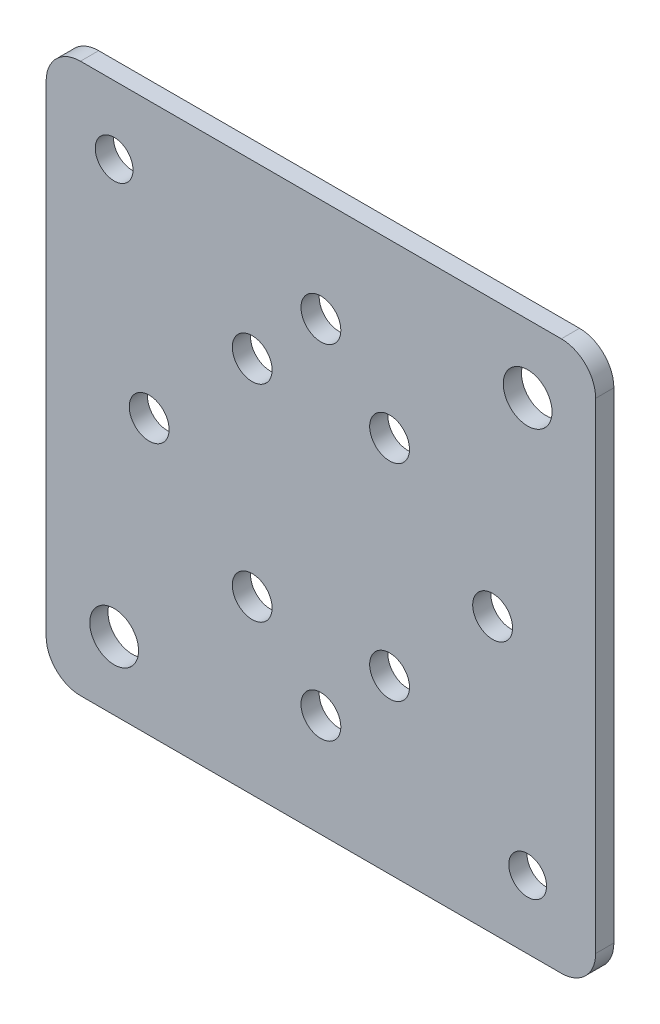
ISO-10303-21;
HEADER;
FILE_DESCRIPTION(('STEP AP214'),'2;1');
FILE_NAME('part.step','',(''),(''),'','','');
FILE_SCHEMA(('AUTOMOTIVE_DESIGN { 1 0 10303 214 1 1 1 1 }'));
ENDSEC;
DATA;
#1=APPLICATION_CONTEXT('core data for automotive mechanical design processes');
#2=APPLICATION_PROTOCOL_DEFINITION('international standard','automotive_design',2000,#1);
#3=PRODUCT_CONTEXT('',#1,'mechanical');
#4=PRODUCT('Part','Part','',(#3));
#5=PRODUCT_RELATED_PRODUCT_CATEGORY('part','',(#4));
#6=PRODUCT_DEFINITION_FORMATION('','',#4);
#7=PRODUCT_DEFINITION_CONTEXT('part definition',#1,'design');
#8=PRODUCT_DEFINITION('design','',#6,#7);
#9=PRODUCT_DEFINITION_SHAPE('','',#8);
#10=(LENGTH_UNIT() NAMED_UNIT(*) SI_UNIT(.MILLI.,.METRE.));
#11=(NAMED_UNIT(*) PLANE_ANGLE_UNIT() SI_UNIT($,.RADIAN.));
#12=(NAMED_UNIT(*) SI_UNIT($,.STERADIAN.) SOLID_ANGLE_UNIT());
#13=UNCERTAINTY_MEASURE_WITH_UNIT(LENGTH_MEASURE(1.E-05),#10,'distance_accuracy_value','');
#14=(GEOMETRIC_REPRESENTATION_CONTEXT(3) GLOBAL_UNCERTAINTY_ASSIGNED_CONTEXT((#13)) GLOBAL_UNIT_ASSIGNED_CONTEXT((#10,
#11,#12)) REPRESENTATION_CONTEXT('',''));
#15=CARTESIAN_POINT('',(0.,0.,0.));
#16=DIRECTION('',(0.,0.,1.));
#17=DIRECTION('',(1.,0.,0.));
#18=AXIS2_PLACEMENT_3D('',#15,#16,#17);
#19=CARTESIAN_POINT('',(40.,40.,-2.65));
#20=DIRECTION('',(1.,0.,0.));
#21=DIRECTION('',(0.,1.,0.));
#22=AXIS2_PLACEMENT_3D('',#19,#20,#21);
#23=PLANE('',#22);
#24=DIRECTION('',(0.,1.,0.));
#25=VECTOR('',#24,1.);
#26=CARTESIAN_POINT('',(40.,40.,-2.65));
#27=LINE('',#26,#25);
#28=CARTESIAN_POINT('',(40.,-35.,-2.65));
#29=VERTEX_POINT('',#28);
#30=CARTESIAN_POINT('',(40.,35.,-2.65));
#31=VERTEX_POINT('',#30);
#32=EDGE_CURVE('E146',#29,#31,#27,.T.);
#33=ORIENTED_EDGE('',*,*,#32,.T.);
#34=DIRECTION('',(0.,0.,1.));
#35=VECTOR('',#34,1.);
#36=CARTESIAN_POINT('',(40.,35.,-2.65));
#37=LINE('',#36,#35);
#38=CARTESIAN_POINT('',(40.,35.,0.));
#39=VERTEX_POINT('',#38);
#40=EDGE_CURVE('E92',#31,#39,#37,.T.);
#41=ORIENTED_EDGE('',*,*,#40,.T.);
#42=DIRECTION('',(0.,1.,0.));
#43=VECTOR('',#42,1.);
#44=CARTESIAN_POINT('',(40.,40.,0.));
#45=LINE('',#44,#43);
#46=CARTESIAN_POINT('',(40.,-35.,0.));
#47=VERTEX_POINT('',#46);
#48=EDGE_CURVE('E84',#47,#39,#45,.T.);
#49=ORIENTED_EDGE('',*,*,#48,.F.);
#50=DIRECTION('',(0.,0.,1.));
#51=VECTOR('',#50,1.);
#52=CARTESIAN_POINT('',(40.,-35.,-2.65));
#53=LINE('',#52,#51);
#54=EDGE_CURVE('E97',#47,#29,#53,.F.);
#55=ORIENTED_EDGE('',*,*,#54,.T.);
#56=EDGE_LOOP('',(#33,#41,#49,#55));
#57=FACE_BOUND('',#56,.T.);
#58=ADVANCED_FACE('F16',(#57),#23,.T.);
#59=CARTESIAN_POINT('',(-40.,-40.,-2.65));
#60=DIRECTION('',(0.,-1.,0.));
#61=DIRECTION('',(0.,0.,-1.));
#62=AXIS2_PLACEMENT_3D('',#59,#60,#61);
#63=PLANE('',#62);
#64=DIRECTION('',(1.,0.,0.));
#65=VECTOR('',#64,1.);
#66=CARTESIAN_POINT('',(-40.,-40.,0.));
#67=LINE('',#66,#65);
#68=CARTESIAN_POINT('',(-35.,-40.,0.));
#69=VERTEX_POINT('',#68);
#70=CARTESIAN_POINT('',(35.,-40.,0.));
#71=VERTEX_POINT('',#70);
#72=EDGE_CURVE('E86',#69,#71,#67,.T.);
#73=ORIENTED_EDGE('',*,*,#72,.F.);
#74=DIRECTION('',(0.,0.,1.));
#75=VECTOR('',#74,1.);
#76=CARTESIAN_POINT('',(-35.,-40.,-2.65));
#77=LINE('',#76,#75);
#78=CARTESIAN_POINT('',(-35.,-40.,-2.65));
#79=VERTEX_POINT('',#78);
#80=EDGE_CURVE('E11',#69,#79,#77,.F.);
#81=ORIENTED_EDGE('',*,*,#80,.T.);
#82=DIRECTION('',(1.,0.,0.));
#83=VECTOR('',#82,1.);
#84=CARTESIAN_POINT('',(-40.,-40.,-2.65));
#85=LINE('',#84,#83);
#86=CARTESIAN_POINT('',(35.,-40.,-2.65));
#87=VERTEX_POINT('',#86);
#88=EDGE_CURVE('E106',#79,#87,#85,.T.);
#89=ORIENTED_EDGE('',*,*,#88,.T.);
#90=DIRECTION('',(0.,0.,1.));
#91=VECTOR('',#90,1.);
#92=CARTESIAN_POINT('',(35.,-40.,-2.65));
#93=LINE('',#92,#91);
#94=EDGE_CURVE('E24',#87,#71,#93,.T.);
#95=ORIENTED_EDGE('',*,*,#94,.T.);
#96=EDGE_LOOP('',(#73,#81,#89,#95));
#97=FACE_BOUND('',#96,.T.);
#98=ADVANCED_FACE('F135',(#97),#63,.T.);
#99=CARTESIAN_POINT('',(-40.,40.,-2.65));
#100=DIRECTION('',(-1.,0.,0.));
#101=DIRECTION('',(0.,-1.,0.));
#102=AXIS2_PLACEMENT_3D('',#99,#100,#101);
#103=PLANE('',#102);
#104=DIRECTION('',(0.,-1.,0.));
#105=VECTOR('',#104,1.);
#106=CARTESIAN_POINT('',(-40.,40.,0.));
#107=LINE('',#106,#105);
#108=CARTESIAN_POINT('',(-40.,35.,0.));
#109=VERTEX_POINT('',#108);
#110=CARTESIAN_POINT('',(-40.,-35.,0.));
#111=VERTEX_POINT('',#110);
#112=EDGE_CURVE('E144',#109,#111,#107,.T.);
#113=ORIENTED_EDGE('',*,*,#112,.F.);
#114=DIRECTION('',(0.,0.,1.));
#115=VECTOR('',#114,1.);
#116=CARTESIAN_POINT('',(-40.,35.,-2.65));
#117=LINE('',#116,#115);
#118=CARTESIAN_POINT('',(-40.,35.,-2.65));
#119=VERTEX_POINT('',#118);
#120=EDGE_CURVE('E38',#109,#119,#117,.F.);
#121=ORIENTED_EDGE('',*,*,#120,.T.);
#122=DIRECTION('',(0.,-1.,0.));
#123=VECTOR('',#122,1.);
#124=CARTESIAN_POINT('',(-40.,40.,-2.65));
#125=LINE('',#124,#123);
#126=CARTESIAN_POINT('',(-40.,-35.,-2.65));
#127=VERTEX_POINT('',#126);
#128=EDGE_CURVE('E110',#119,#127,#125,.T.);
#129=ORIENTED_EDGE('',*,*,#128,.T.);
#130=DIRECTION('',(0.,0.,1.));
#131=VECTOR('',#130,1.);
#132=CARTESIAN_POINT('',(-40.,-35.,-2.65));
#133=LINE('',#132,#131);
#134=EDGE_CURVE('E131',#127,#111,#133,.T.);
#135=ORIENTED_EDGE('',*,*,#134,.T.);
#136=EDGE_LOOP('',(#113,#121,#129,#135));
#137=FACE_BOUND('',#136,.T.);
#138=ADVANCED_FACE('F143',(#137),#103,.T.);
#139=CARTESIAN_POINT('',(-40.,40.,-2.65));
#140=DIRECTION('',(0.,1.,0.));
#141=DIRECTION('',(0.,0.,1.));
#142=AXIS2_PLACEMENT_3D('',#139,#140,#141);
#143=PLANE('',#142);
#144=DIRECTION('',(-1.,0.,0.));
#145=VECTOR('',#144,1.);
#146=CARTESIAN_POINT('',(-40.,40.,0.));
#147=LINE('',#146,#145);
#148=CARTESIAN_POINT('',(35.,40.,0.));
#149=VERTEX_POINT('',#148);
#150=CARTESIAN_POINT('',(-35.,40.,0.));
#151=VERTEX_POINT('',#150);
#152=EDGE_CURVE('E100',#149,#151,#147,.T.);
#153=ORIENTED_EDGE('',*,*,#152,.F.);
#154=DIRECTION('',(0.,0.,1.));
#155=VECTOR('',#154,1.);
#156=CARTESIAN_POINT('',(35.,40.,-2.65));
#157=LINE('',#156,#155);
#158=CARTESIAN_POINT('',(35.,40.,-2.65));
#159=VERTEX_POINT('',#158);
#160=EDGE_CURVE('E123',#149,#159,#157,.F.);
#161=ORIENTED_EDGE('',*,*,#160,.T.);
#162=DIRECTION('',(-1.,0.,0.));
#163=VECTOR('',#162,1.);
#164=CARTESIAN_POINT('',(-40.,40.,-2.65));
#165=LINE('',#164,#163);
#166=CARTESIAN_POINT('',(-35.,40.,-2.65));
#167=VERTEX_POINT('',#166);
#168=EDGE_CURVE('E150',#159,#167,#165,.T.);
#169=ORIENTED_EDGE('',*,*,#168,.T.);
#170=DIRECTION('',(0.,0.,1.));
#171=VECTOR('',#170,1.);
#172=CARTESIAN_POINT('',(-35.,40.,-2.65));
#173=LINE('',#172,#171);
#174=EDGE_CURVE('E120',#167,#151,#173,.T.);
#175=ORIENTED_EDGE('',*,*,#174,.T.);
#176=EDGE_LOOP('',(#153,#161,#169,#175));
#177=FACE_BOUND('',#176,.T.);
#178=ADVANCED_FACE('F274',(#177),#143,.T.);
#179=CARTESIAN_POINT('',(0.,0.,-2.65));
#180=DIRECTION('',(0.,0.,1.));
#181=DIRECTION('',(1.,0.,0.));
#182=AXIS2_PLACEMENT_3D('',#179,#180,#181);
#183=PLANE('',#182);
#184=CARTESIAN_POINT('',(-10.,15.,-2.65));
#185=DIRECTION('',(0.,0.,1.));
#186=DIRECTION('',(1.,0.,0.));
#187=AXIS2_PLACEMENT_3D('',#184,#185,#186);
#188=CIRCLE('',#187,2.9);
#189=CARTESIAN_POINT('',(-7.1,15.,-2.65));
#190=VERTEX_POINT('',#189);
#191=EDGE_CURVE('E219',#190,#190,#188,.T.);
#192=ORIENTED_EDGE('',*,*,#191,.T.);
#193=EDGE_LOOP('',(#192));
#194=FACE_BOUND('',#193,.T.);
#195=CARTESIAN_POINT('',(10.,15.,-2.65));
#196=DIRECTION('',(0.,0.,1.));
#197=DIRECTION('',(1.,0.,0.));
#198=AXIS2_PLACEMENT_3D('',#195,#196,#197);
#199=CIRCLE('',#198,2.9);
#200=CARTESIAN_POINT('',(12.9,15.,-2.65));
#201=VERTEX_POINT('',#200);
#202=EDGE_CURVE('E213',#201,#201,#199,.T.);
#203=ORIENTED_EDGE('',*,*,#202,.T.);
#204=EDGE_LOOP('',(#203));
#205=FACE_BOUND('',#204,.T.);
#206=CARTESIAN_POINT('',(10.,-15.,-2.65));
#207=DIRECTION('',(0.,0.,1.));
#208=DIRECTION('',(1.,0.,0.));
#209=AXIS2_PLACEMENT_3D('',#206,#207,#208);
#210=CIRCLE('',#209,2.9);
#211=CARTESIAN_POINT('',(12.9,-15.,-2.65));
#212=VERTEX_POINT('',#211);
#213=EDGE_CURVE('E207',#212,#212,#210,.T.);
#214=ORIENTED_EDGE('',*,*,#213,.T.);
#215=EDGE_LOOP('',(#214));
#216=FACE_BOUND('',#215,.T.);
#217=CARTESIAN_POINT('',(-10.,-15.,-2.65));
#218=DIRECTION('',(0.,0.,1.));
#219=DIRECTION('',(1.,0.,0.));
#220=AXIS2_PLACEMENT_3D('',#217,#218,#219);
#221=CIRCLE('',#220,2.9);
#222=CARTESIAN_POINT('',(-7.1,-15.,-2.65));
#223=VERTEX_POINT('',#222);
#224=EDGE_CURVE('E201',#223,#223,#221,.T.);
#225=ORIENTED_EDGE('',*,*,#224,.T.);
#226=EDGE_LOOP('',(#225));
#227=FACE_BOUND('',#226,.T.);
#228=CARTESIAN_POINT('',(-25.,0.,-2.65));
#229=DIRECTION('',(0.,0.,1.));
#230=DIRECTION('',(1.,0.,0.));
#231=AXIS2_PLACEMENT_3D('',#228,#229,#230);
#232=CIRCLE('',#231,2.9);
#233=CARTESIAN_POINT('',(-22.1,0.,-2.65));
#234=VERTEX_POINT('',#233);
#235=EDGE_CURVE('E195',#234,#234,#232,.T.);
#236=ORIENTED_EDGE('',*,*,#235,.T.);
#237=EDGE_LOOP('',(#236));
#238=FACE_BOUND('',#237,.T.);
#239=CARTESIAN_POINT('',(25.,0.,-2.65));
#240=DIRECTION('',(0.,0.,1.));
#241=DIRECTION('',(1.,0.,0.));
#242=AXIS2_PLACEMENT_3D('',#239,#240,#241);
#243=CIRCLE('',#242,2.9);
#244=CARTESIAN_POINT('',(27.9,0.,-2.65));
#245=VERTEX_POINT('',#244);
#246=EDGE_CURVE('E189',#245,#245,#243,.T.);
#247=ORIENTED_EDGE('',*,*,#246,.T.);
#248=EDGE_LOOP('',(#247));
#249=FACE_BOUND('',#248,.T.);
#250=CARTESIAN_POINT('',(0.,25.,-2.65));
#251=DIRECTION('',(0.,0.,1.));
#252=DIRECTION('',(1.,0.,0.));
#253=AXIS2_PLACEMENT_3D('',#250,#251,#252);
#254=CIRCLE('',#253,2.9);
#255=CARTESIAN_POINT('',(2.9,25.,-2.65));
#256=VERTEX_POINT('',#255);
#257=EDGE_CURVE('E183',#256,#256,#254,.T.);
#258=ORIENTED_EDGE('',*,*,#257,.T.);
#259=EDGE_LOOP('',(#258));
#260=FACE_BOUND('',#259,.T.);
#261=CARTESIAN_POINT('',(0.,-25.,-2.65));
#262=DIRECTION('',(0.,0.,1.));
#263=DIRECTION('',(1.,0.,0.));
#264=AXIS2_PLACEMENT_3D('',#261,#262,#263);
#265=CIRCLE('',#264,2.9);
#266=CARTESIAN_POINT('',(2.90000000000001,-25.,-2.65));
#267=VERTEX_POINT('',#266);
#268=EDGE_CURVE('E177',#267,#267,#265,.T.);
#269=ORIENTED_EDGE('',*,*,#268,.T.);
#270=EDGE_LOOP('',(#269));
#271=FACE_BOUND('',#270,.T.);
#272=CARTESIAN_POINT('',(-30.1,-30.1,-2.65));
#273=DIRECTION('',(0.,0.,1.));
#274=DIRECTION('',(1.,0.,0.));
#275=AXIS2_PLACEMENT_3D('',#272,#273,#274);
#276=CIRCLE('',#275,3.55);
#277=CARTESIAN_POINT('',(-26.55,-30.1,-2.65));
#278=VERTEX_POINT('',#277);
#279=EDGE_CURVE('E171',#278,#278,#276,.T.);
#280=ORIENTED_EDGE('',*,*,#279,.T.);
#281=EDGE_LOOP('',(#280));
#282=FACE_BOUND('',#281,.T.);
#283=CARTESIAN_POINT('',(30.1,30.1,-2.65));
#284=DIRECTION('',(0.,0.,1.));
#285=DIRECTION('',(1.,0.,0.));
#286=AXIS2_PLACEMENT_3D('',#283,#284,#285);
#287=CIRCLE('',#286,3.55);
#288=CARTESIAN_POINT('',(33.65,30.1,-2.65));
#289=VERTEX_POINT('',#288);
#290=EDGE_CURVE('E165',#289,#289,#287,.T.);
#291=ORIENTED_EDGE('',*,*,#290,.T.);
#292=EDGE_LOOP('',(#291));
#293=FACE_BOUND('',#292,.T.);
#294=CARTESIAN_POINT('',(-30.1,30.1,-2.65));
#295=DIRECTION('',(0.,0.,1.));
#296=DIRECTION('',(1.,0.,0.));
#297=AXIS2_PLACEMENT_3D('',#294,#295,#296);
#298=CIRCLE('',#297,2.75);
#299=CARTESIAN_POINT('',(-27.35,30.1,-2.65));
#300=VERTEX_POINT('',#299);
#301=EDGE_CURVE('E159',#300,#300,#298,.T.);
#302=ORIENTED_EDGE('',*,*,#301,.T.);
#303=EDGE_LOOP('',(#302));
#304=FACE_BOUND('',#303,.T.);
#305=CARTESIAN_POINT('',(30.1,-30.1,-2.65));
#306=DIRECTION('',(0.,0.,1.));
#307=DIRECTION('',(1.,0.,0.));
#308=AXIS2_PLACEMENT_3D('',#305,#306,#307);
#309=CIRCLE('',#308,2.75);
#310=CARTESIAN_POINT('',(32.85,-30.1,-2.65));
#311=VERTEX_POINT('',#310);
#312=EDGE_CURVE('E101',#311,#311,#309,.T.);
#313=ORIENTED_EDGE('',*,*,#312,.T.);
#314=EDGE_LOOP('',(#313));
#315=FACE_BOUND('',#314,.T.);
#316=ORIENTED_EDGE('',*,*,#168,.F.);
#317=CARTESIAN_POINT('',(35.,35.,-2.65));
#318=DIRECTION('',(0.,0.,1.));
#319=DIRECTION('',(1.,0.,0.));
#320=AXIS2_PLACEMENT_3D('',#317,#318,#319);
#321=CIRCLE('',#320,5.);
#322=EDGE_CURVE('E129',#159,#31,#321,.F.);
#323=ORIENTED_EDGE('',*,*,#322,.T.);
#324=ORIENTED_EDGE('',*,*,#32,.F.);
#325=CARTESIAN_POINT('',(35.,-35.,-2.65));
#326=DIRECTION('',(0.,0.,1.));
#327=DIRECTION('',(1.,0.,0.));
#328=AXIS2_PLACEMENT_3D('',#325,#326,#327);
#329=CIRCLE('',#328,5.);
#330=EDGE_CURVE('E105',#29,#87,#329,.F.);
#331=ORIENTED_EDGE('',*,*,#330,.T.);
#332=ORIENTED_EDGE('',*,*,#88,.F.);
#333=CARTESIAN_POINT('',(-35.,-35.,-2.65));
#334=DIRECTION('',(0.,0.,1.));
#335=DIRECTION('',(1.,0.,0.));
#336=AXIS2_PLACEMENT_3D('',#333,#334,#335);
#337=CIRCLE('',#336,5.);
#338=EDGE_CURVE('E31',#79,#127,#337,.F.);
#339=ORIENTED_EDGE('',*,*,#338,.T.);
#340=ORIENTED_EDGE('',*,*,#128,.F.);
#341=CARTESIAN_POINT('',(-35.,35.,-2.65));
#342=DIRECTION('',(0.,0.,1.));
#343=DIRECTION('',(1.,0.,0.));
#344=AXIS2_PLACEMENT_3D('',#341,#342,#343);
#345=CIRCLE('',#344,5.);
#346=EDGE_CURVE('E127',#119,#167,#345,.F.);
#347=ORIENTED_EDGE('',*,*,#346,.T.);
#348=EDGE_LOOP('',(#316,#323,#324,#331,#332,#339,#340,#347));
#349=FACE_BOUND('',#348,.T.);
#350=ADVANCED_FACE('F138',(#194,#205,#216,#227,#238,#249,#260,#271,#282,#293,#304,#315,#349),
#183,.F.);
#351=CARTESIAN_POINT('',(0.,0.,0.));
#352=DIRECTION('',(0.,0.,1.));
#353=DIRECTION('',(1.,0.,0.));
#354=AXIS2_PLACEMENT_3D('',#351,#352,#353);
#355=PLANE('',#354);
#356=CARTESIAN_POINT('',(-10.,15.,0.));
#357=DIRECTION('',(0.,0.,1.));
#358=DIRECTION('',(1.,0.,0.));
#359=AXIS2_PLACEMENT_3D('',#356,#357,#358);
#360=CIRCLE('',#359,2.9);
#361=CARTESIAN_POINT('',(-7.1,15.,0.));
#362=VERTEX_POINT('',#361);
#363=EDGE_CURVE('E222',#362,#362,#360,.T.);
#364=ORIENTED_EDGE('',*,*,#363,.F.);
#365=EDGE_LOOP('',(#364));
#366=FACE_BOUND('',#365,.T.);
#367=CARTESIAN_POINT('',(10.,15.,0.));
#368=DIRECTION('',(0.,0.,1.));
#369=DIRECTION('',(1.,0.,0.));
#370=AXIS2_PLACEMENT_3D('',#367,#368,#369);
#371=CIRCLE('',#370,2.9);
#372=CARTESIAN_POINT('',(12.9,15.,0.));
#373=VERTEX_POINT('',#372);
#374=EDGE_CURVE('E216',#373,#373,#371,.T.);
#375=ORIENTED_EDGE('',*,*,#374,.F.);
#376=EDGE_LOOP('',(#375));
#377=FACE_BOUND('',#376,.T.);
#378=CARTESIAN_POINT('',(10.,-15.,0.));
#379=DIRECTION('',(0.,0.,1.));
#380=DIRECTION('',(1.,0.,0.));
#381=AXIS2_PLACEMENT_3D('',#378,#379,#380);
#382=CIRCLE('',#381,2.9);
#383=CARTESIAN_POINT('',(12.9,-15.,0.));
#384=VERTEX_POINT('',#383);
#385=EDGE_CURVE('E210',#384,#384,#382,.T.);
#386=ORIENTED_EDGE('',*,*,#385,.F.);
#387=EDGE_LOOP('',(#386));
#388=FACE_BOUND('',#387,.T.);
#389=CARTESIAN_POINT('',(-10.,-15.,0.));
#390=DIRECTION('',(0.,0.,1.));
#391=DIRECTION('',(1.,0.,0.));
#392=AXIS2_PLACEMENT_3D('',#389,#390,#391);
#393=CIRCLE('',#392,2.9);
#394=CARTESIAN_POINT('',(-7.1,-15.,0.));
#395=VERTEX_POINT('',#394);
#396=EDGE_CURVE('E204',#395,#395,#393,.T.);
#397=ORIENTED_EDGE('',*,*,#396,.F.);
#398=EDGE_LOOP('',(#397));
#399=FACE_BOUND('',#398,.T.);
#400=CARTESIAN_POINT('',(-25.,0.,0.));
#401=DIRECTION('',(0.,0.,1.));
#402=DIRECTION('',(1.,0.,0.));
#403=AXIS2_PLACEMENT_3D('',#400,#401,#402);
#404=CIRCLE('',#403,2.9);
#405=CARTESIAN_POINT('',(-22.1,0.,0.));
#406=VERTEX_POINT('',#405);
#407=EDGE_CURVE('E198',#406,#406,#404,.T.);
#408=ORIENTED_EDGE('',*,*,#407,.F.);
#409=EDGE_LOOP('',(#408));
#410=FACE_BOUND('',#409,.T.);
#411=CARTESIAN_POINT('',(25.,0.,0.));
#412=DIRECTION('',(0.,0.,1.));
#413=DIRECTION('',(1.,0.,0.));
#414=AXIS2_PLACEMENT_3D('',#411,#412,#413);
#415=CIRCLE('',#414,2.9);
#416=CARTESIAN_POINT('',(27.9,0.,0.));
#417=VERTEX_POINT('',#416);
#418=EDGE_CURVE('E192',#417,#417,#415,.T.);
#419=ORIENTED_EDGE('',*,*,#418,.F.);
#420=EDGE_LOOP('',(#419));
#421=FACE_BOUND('',#420,.T.);
#422=CARTESIAN_POINT('',(0.,25.,0.));
#423=DIRECTION('',(0.,0.,1.));
#424=DIRECTION('',(1.,0.,0.));
#425=AXIS2_PLACEMENT_3D('',#422,#423,#424);
#426=CIRCLE('',#425,2.9);
#427=CARTESIAN_POINT('',(2.9,25.,0.));
#428=VERTEX_POINT('',#427);
#429=EDGE_CURVE('E186',#428,#428,#426,.T.);
#430=ORIENTED_EDGE('',*,*,#429,.F.);
#431=EDGE_LOOP('',(#430));
#432=FACE_BOUND('',#431,.T.);
#433=CARTESIAN_POINT('',(0.,-25.,0.));
#434=DIRECTION('',(0.,0.,1.));
#435=DIRECTION('',(1.,0.,0.));
#436=AXIS2_PLACEMENT_3D('',#433,#434,#435);
#437=CIRCLE('',#436,2.9);
#438=CARTESIAN_POINT('',(2.90000000000001,-25.,0.));
#439=VERTEX_POINT('',#438);
#440=EDGE_CURVE('E180',#439,#439,#437,.T.);
#441=ORIENTED_EDGE('',*,*,#440,.F.);
#442=EDGE_LOOP('',(#441));
#443=FACE_BOUND('',#442,.T.);
#444=CARTESIAN_POINT('',(-30.1,-30.1,0.));
#445=DIRECTION('',(0.,0.,1.));
#446=DIRECTION('',(1.,0.,0.));
#447=AXIS2_PLACEMENT_3D('',#444,#445,#446);
#448=CIRCLE('',#447,3.55);
#449=CARTESIAN_POINT('',(-26.55,-30.1,0.));
#450=VERTEX_POINT('',#449);
#451=EDGE_CURVE('E174',#450,#450,#448,.T.);
#452=ORIENTED_EDGE('',*,*,#451,.F.);
#453=EDGE_LOOP('',(#452));
#454=FACE_BOUND('',#453,.T.);
#455=CARTESIAN_POINT('',(30.1,30.1,0.));
#456=DIRECTION('',(0.,0.,1.));
#457=DIRECTION('',(1.,0.,0.));
#458=AXIS2_PLACEMENT_3D('',#455,#456,#457);
#459=CIRCLE('',#458,3.55);
#460=CARTESIAN_POINT('',(33.65,30.1,0.));
#461=VERTEX_POINT('',#460);
#462=EDGE_CURVE('E168',#461,#461,#459,.T.);
#463=ORIENTED_EDGE('',*,*,#462,.F.);
#464=EDGE_LOOP('',(#463));
#465=FACE_BOUND('',#464,.T.);
#466=CARTESIAN_POINT('',(-30.1,30.1,0.));
#467=DIRECTION('',(0.,0.,1.));
#468=DIRECTION('',(1.,0.,0.));
#469=AXIS2_PLACEMENT_3D('',#466,#467,#468);
#470=CIRCLE('',#469,2.75);
#471=CARTESIAN_POINT('',(-27.35,30.1,0.));
#472=VERTEX_POINT('',#471);
#473=EDGE_CURVE('E162',#472,#472,#470,.T.);
#474=ORIENTED_EDGE('',*,*,#473,.F.);
#475=EDGE_LOOP('',(#474));
#476=FACE_BOUND('',#475,.T.);
#477=CARTESIAN_POINT('',(30.1,-30.1,0.));
#478=DIRECTION('',(0.,0.,1.));
#479=DIRECTION('',(1.,0.,0.));
#480=AXIS2_PLACEMENT_3D('',#477,#478,#479);
#481=CIRCLE('',#480,2.75);
#482=CARTESIAN_POINT('',(32.85,-30.1,0.));
#483=VERTEX_POINT('',#482);
#484=EDGE_CURVE('E156',#483,#483,#481,.T.);
#485=ORIENTED_EDGE('',*,*,#484,.F.);
#486=EDGE_LOOP('',(#485));
#487=FACE_BOUND('',#486,.T.);
#488=ORIENTED_EDGE('',*,*,#48,.T.);
#489=CARTESIAN_POINT('',(35.,35.,0.));
#490=DIRECTION('',(0.,0.,1.));
#491=DIRECTION('',(1.,0.,0.));
#492=AXIS2_PLACEMENT_3D('',#489,#490,#491);
#493=CIRCLE('',#492,5.);
#494=EDGE_CURVE('E118',#39,#149,#493,.T.);
#495=ORIENTED_EDGE('',*,*,#494,.T.);
#496=ORIENTED_EDGE('',*,*,#152,.T.);
#497=CARTESIAN_POINT('',(-35.,35.,0.));
#498=DIRECTION('',(0.,0.,1.));
#499=DIRECTION('',(1.,0.,0.));
#500=AXIS2_PLACEMENT_3D('',#497,#498,#499);
#501=CIRCLE('',#500,5.);
#502=EDGE_CURVE('E116',#151,#109,#501,.T.);
#503=ORIENTED_EDGE('',*,*,#502,.T.);
#504=ORIENTED_EDGE('',*,*,#112,.T.);
#505=CARTESIAN_POINT('',(-35.,-35.,0.));
#506=DIRECTION('',(0.,0.,1.));
#507=DIRECTION('',(1.,0.,0.));
#508=AXIS2_PLACEMENT_3D('',#505,#506,#507);
#509=CIRCLE('',#508,5.);
#510=EDGE_CURVE('E91',#111,#69,#509,.T.);
#511=ORIENTED_EDGE('',*,*,#510,.T.);
#512=ORIENTED_EDGE('',*,*,#72,.T.);
#513=CARTESIAN_POINT('',(35.,-35.,0.));
#514=DIRECTION('',(0.,0.,1.));
#515=DIRECTION('',(1.,0.,0.));
#516=AXIS2_PLACEMENT_3D('',#513,#514,#515);
#517=CIRCLE('',#516,5.);
#518=EDGE_CURVE('E82',#71,#47,#517,.T.);
#519=ORIENTED_EDGE('',*,*,#518,.T.);
#520=EDGE_LOOP('',(#488,#495,#496,#503,#504,#511,#512,#519));
#521=FACE_BOUND('',#520,.T.);
#522=ADVANCED_FACE('F18',(#366,#377,#388,#399,#410,#421,#432,#443,#454,#465,#476,#487,#521),
#355,.T.);
#523=CARTESIAN_POINT('',(30.1,-30.1,0.));
#524=DIRECTION('',(0.,0.,1.));
#525=DIRECTION('',(1.,0.,0.));
#526=AXIS2_PLACEMENT_3D('',#523,#524,#525);
#527=CYLINDRICAL_SURFACE('',#526,2.75);
#528=ORIENTED_EDGE('',*,*,#312,.F.);
#529=EDGE_LOOP('',(#528));
#530=FACE_BOUND('',#529,.T.);
#531=ORIENTED_EDGE('',*,*,#484,.T.);
#532=EDGE_LOOP('',(#531));
#533=FACE_BOUND('',#532,.T.);
#534=ADVANCED_FACE('F230',(#530,#533),#527,.F.);
#535=CARTESIAN_POINT('',(-30.1,30.1,0.));
#536=DIRECTION('',(0.,0.,1.));
#537=DIRECTION('',(1.,0.,0.));
#538=AXIS2_PLACEMENT_3D('',#535,#536,#537);
#539=CYLINDRICAL_SURFACE('',#538,2.75);
#540=ORIENTED_EDGE('',*,*,#301,.F.);
#541=EDGE_LOOP('',(#540));
#542=FACE_BOUND('',#541,.T.);
#543=ORIENTED_EDGE('',*,*,#473,.T.);
#544=EDGE_LOOP('',(#543));
#545=FACE_BOUND('',#544,.T.);
#546=ADVANCED_FACE('F254',(#542,#545),#539,.F.);
#547=CARTESIAN_POINT('',(30.1,30.1,0.));
#548=DIRECTION('',(0.,0.,1.));
#549=DIRECTION('',(1.,0.,0.));
#550=AXIS2_PLACEMENT_3D('',#547,#548,#549);
#551=CYLINDRICAL_SURFACE('',#550,3.55);
#552=ORIENTED_EDGE('',*,*,#290,.F.);
#553=EDGE_LOOP('',(#552));
#554=FACE_BOUND('',#553,.T.);
#555=ORIENTED_EDGE('',*,*,#462,.T.);
#556=EDGE_LOOP('',(#555));
#557=FACE_BOUND('',#556,.T.);
#558=ADVANCED_FACE('F261',(#554,#557),#551,.F.);
#559=CARTESIAN_POINT('',(-30.1,-30.1,0.));
#560=DIRECTION('',(0.,0.,1.));
#561=DIRECTION('',(1.,0.,0.));
#562=AXIS2_PLACEMENT_3D('',#559,#560,#561);
#563=CYLINDRICAL_SURFACE('',#562,3.55);
#564=ORIENTED_EDGE('',*,*,#279,.F.);
#565=EDGE_LOOP('',(#564));
#566=FACE_BOUND('',#565,.T.);
#567=ORIENTED_EDGE('',*,*,#451,.T.);
#568=EDGE_LOOP('',(#567));
#569=FACE_BOUND('',#568,.T.);
#570=ADVANCED_FACE('F375',(#566,#569),#563,.F.);
#571=CARTESIAN_POINT('',(0.,-25.,0.));
#572=DIRECTION('',(0.,0.,1.));
#573=DIRECTION('',(1.,0.,0.));
#574=AXIS2_PLACEMENT_3D('',#571,#572,#573);
#575=CYLINDRICAL_SURFACE('',#574,2.9);
#576=ORIENTED_EDGE('',*,*,#268,.F.);
#577=EDGE_LOOP('',(#576));
#578=FACE_BOUND('',#577,.T.);
#579=ORIENTED_EDGE('',*,*,#440,.T.);
#580=EDGE_LOOP('',(#579));
#581=FACE_BOUND('',#580,.T.);
#582=ADVANCED_FACE('F366',(#578,#581),#575,.F.);
#583=CARTESIAN_POINT('',(0.,25.,0.));
#584=DIRECTION('',(0.,0.,1.));
#585=DIRECTION('',(1.,0.,0.));
#586=AXIS2_PLACEMENT_3D('',#583,#584,#585);
#587=CYLINDRICAL_SURFACE('',#586,2.9);
#588=ORIENTED_EDGE('',*,*,#257,.F.);
#589=EDGE_LOOP('',(#588));
#590=FACE_BOUND('',#589,.T.);
#591=ORIENTED_EDGE('',*,*,#429,.T.);
#592=EDGE_LOOP('',(#591));
#593=FACE_BOUND('',#592,.T.);
#594=ADVANCED_FACE('F357',(#590,#593),#587,.F.);
#595=CARTESIAN_POINT('',(25.,0.,0.));
#596=DIRECTION('',(0.,0.,1.));
#597=DIRECTION('',(1.,0.,0.));
#598=AXIS2_PLACEMENT_3D('',#595,#596,#597);
#599=CYLINDRICAL_SURFACE('',#598,2.9);
#600=ORIENTED_EDGE('',*,*,#246,.F.);
#601=EDGE_LOOP('',(#600));
#602=FACE_BOUND('',#601,.T.);
#603=ORIENTED_EDGE('',*,*,#418,.T.);
#604=EDGE_LOOP('',(#603));
#605=FACE_BOUND('',#604,.T.);
#606=ADVANCED_FACE('F348',(#602,#605),#599,.F.);
#607=CARTESIAN_POINT('',(-25.,0.,0.));
#608=DIRECTION('',(0.,0.,1.));
#609=DIRECTION('',(1.,0.,0.));
#610=AXIS2_PLACEMENT_3D('',#607,#608,#609);
#611=CYLINDRICAL_SURFACE('',#610,2.9);
#612=ORIENTED_EDGE('',*,*,#235,.F.);
#613=EDGE_LOOP('',(#612));
#614=FACE_BOUND('',#613,.T.);
#615=ORIENTED_EDGE('',*,*,#407,.T.);
#616=EDGE_LOOP('',(#615));
#617=FACE_BOUND('',#616,.T.);
#618=ADVANCED_FACE('F339',(#614,#617),#611,.F.);
#619=CARTESIAN_POINT('',(-10.,-15.,0.));
#620=DIRECTION('',(0.,0.,1.));
#621=DIRECTION('',(1.,0.,0.));
#622=AXIS2_PLACEMENT_3D('',#619,#620,#621);
#623=CYLINDRICAL_SURFACE('',#622,2.9);
#624=ORIENTED_EDGE('',*,*,#224,.F.);
#625=EDGE_LOOP('',(#624));
#626=FACE_BOUND('',#625,.T.);
#627=ORIENTED_EDGE('',*,*,#396,.T.);
#628=EDGE_LOOP('',(#627));
#629=FACE_BOUND('',#628,.T.);
#630=ADVANCED_FACE('F330',(#626,#629),#623,.F.);
#631=CARTESIAN_POINT('',(10.,-15.,0.));
#632=DIRECTION('',(0.,0.,1.));
#633=DIRECTION('',(1.,0.,0.));
#634=AXIS2_PLACEMENT_3D('',#631,#632,#633);
#635=CYLINDRICAL_SURFACE('',#634,2.9);
#636=ORIENTED_EDGE('',*,*,#213,.F.);
#637=EDGE_LOOP('',(#636));
#638=FACE_BOUND('',#637,.T.);
#639=ORIENTED_EDGE('',*,*,#385,.T.);
#640=EDGE_LOOP('',(#639));
#641=FACE_BOUND('',#640,.T.);
#642=ADVANCED_FACE('F321',(#638,#641),#635,.F.);
#643=CARTESIAN_POINT('',(10.,15.,0.));
#644=DIRECTION('',(0.,0.,1.));
#645=DIRECTION('',(1.,0.,0.));
#646=AXIS2_PLACEMENT_3D('',#643,#644,#645);
#647=CYLINDRICAL_SURFACE('',#646,2.9);
#648=ORIENTED_EDGE('',*,*,#202,.F.);
#649=EDGE_LOOP('',(#648));
#650=FACE_BOUND('',#649,.T.);
#651=ORIENTED_EDGE('',*,*,#374,.T.);
#652=EDGE_LOOP('',(#651));
#653=FACE_BOUND('',#652,.T.);
#654=ADVANCED_FACE('F312',(#650,#653),#647,.F.);
#655=CARTESIAN_POINT('',(-10.,15.,0.));
#656=DIRECTION('',(0.,0.,1.));
#657=DIRECTION('',(1.,0.,0.));
#658=AXIS2_PLACEMENT_3D('',#655,#656,#657);
#659=CYLINDRICAL_SURFACE('',#658,2.9);
#660=ORIENTED_EDGE('',*,*,#191,.F.);
#661=EDGE_LOOP('',(#660));
#662=FACE_BOUND('',#661,.T.);
#663=ORIENTED_EDGE('',*,*,#363,.T.);
#664=EDGE_LOOP('',(#663));
#665=FACE_BOUND('',#664,.T.);
#666=ADVANCED_FACE('F226',(#662,#665),#659,.F.);
#667=CARTESIAN_POINT('',(35.,35.,-2.65));
#668=DIRECTION('',(0.,0.,1.));
#669=DIRECTION('',(1.,0.,0.));
#670=AXIS2_PLACEMENT_3D('',#667,#668,#669);
#671=CYLINDRICAL_SURFACE('',#670,5.);
#672=ORIENTED_EDGE('',*,*,#322,.F.);
#673=ORIENTED_EDGE('',*,*,#160,.F.);
#674=ORIENTED_EDGE('',*,*,#494,.F.);
#675=ORIENTED_EDGE('',*,*,#40,.F.);
#676=EDGE_LOOP('',(#672,#673,#674,#675));
#677=FACE_BOUND('',#676,.T.);
#678=ADVANCED_FACE('F276',(#677),#671,.T.);
#679=CARTESIAN_POINT('',(-35.,35.,-2.65));
#680=DIRECTION('',(0.,0.,1.));
#681=DIRECTION('',(1.,0.,0.));
#682=AXIS2_PLACEMENT_3D('',#679,#680,#681);
#683=CYLINDRICAL_SURFACE('',#682,5.);
#684=ORIENTED_EDGE('',*,*,#346,.F.);
#685=ORIENTED_EDGE('',*,*,#120,.F.);
#686=ORIENTED_EDGE('',*,*,#502,.F.);
#687=ORIENTED_EDGE('',*,*,#174,.F.);
#688=EDGE_LOOP('',(#684,#685,#686,#687));
#689=FACE_BOUND('',#688,.T.);
#690=ADVANCED_FACE('F279',(#689),#683,.T.);
#691=CARTESIAN_POINT('',(-35.,-35.,-2.65));
#692=DIRECTION('',(0.,0.,1.));
#693=DIRECTION('',(1.,0.,0.));
#694=AXIS2_PLACEMENT_3D('',#691,#692,#693);
#695=CYLINDRICAL_SURFACE('',#694,5.);
#696=ORIENTED_EDGE('',*,*,#338,.F.);
#697=ORIENTED_EDGE('',*,*,#80,.F.);
#698=ORIENTED_EDGE('',*,*,#510,.F.);
#699=ORIENTED_EDGE('',*,*,#134,.F.);
#700=EDGE_LOOP('',(#696,#697,#698,#699));
#701=FACE_BOUND('',#700,.T.);
#702=ADVANCED_FACE('F141',(#701),#695,.T.);
#703=CARTESIAN_POINT('',(35.,-35.,-2.65));
#704=DIRECTION('',(0.,0.,1.));
#705=DIRECTION('',(1.,0.,0.));
#706=AXIS2_PLACEMENT_3D('',#703,#704,#705);
#707=CYLINDRICAL_SURFACE('',#706,5.);
#708=ORIENTED_EDGE('',*,*,#330,.F.);
#709=ORIENTED_EDGE('',*,*,#54,.F.);
#710=ORIENTED_EDGE('',*,*,#518,.F.);
#711=ORIENTED_EDGE('',*,*,#94,.F.);
#712=EDGE_LOOP('',(#708,#709,#710,#711));
#713=FACE_BOUND('',#712,.T.);
#714=ADVANCED_FACE('F104',(#713),#707,.T.);
#715=CLOSED_SHELL('',(#58,#98,#138,#178,#350,#522,#534,#546,#558,#570,#582,#594,#606,#618,#630,
#642,#654,#666,#678,#690,#702,#714));
#716=MANIFOLD_SOLID_BREP('B1',#715);
#717=ADVANCED_BREP_SHAPE_REPRESENTATION('',(#18,#716),#14);
#718=SHAPE_DEFINITION_REPRESENTATION(#9,#717);
ENDSEC;
END-ISO-10303-21;
